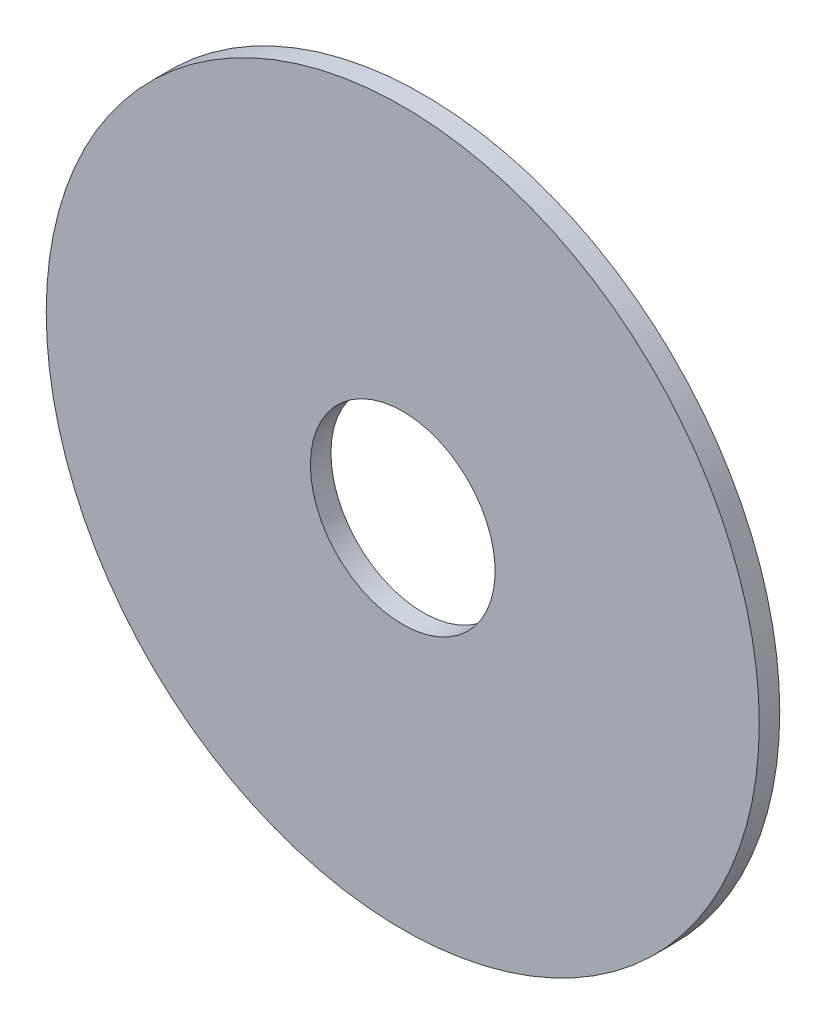
ISO-10303-21;
HEADER;
FILE_DESCRIPTION(('STEP AP214'),'2;1');
FILE_NAME('part.step','',(''),(''),'','','');
FILE_SCHEMA(('AUTOMOTIVE_DESIGN { 1 0 10303 214 1 1 1 1 }'));
ENDSEC;
DATA;
#1=APPLICATION_CONTEXT('core data for automotive mechanical design processes');
#2=APPLICATION_PROTOCOL_DEFINITION('international standard','automotive_design',2000,#1);
#3=PRODUCT_CONTEXT('',#1,'mechanical');
#4=PRODUCT('Part','Part','',(#3));
#5=PRODUCT_RELATED_PRODUCT_CATEGORY('part','',(#4));
#6=PRODUCT_DEFINITION_FORMATION('','',#4);
#7=PRODUCT_DEFINITION_CONTEXT('part definition',#1,'design');
#8=PRODUCT_DEFINITION('design','',#6,#7);
#9=PRODUCT_DEFINITION_SHAPE('','',#8);
#10=(LENGTH_UNIT() NAMED_UNIT(*) SI_UNIT(.MILLI.,.METRE.));
#11=(NAMED_UNIT(*) PLANE_ANGLE_UNIT() SI_UNIT($,.RADIAN.));
#12=(NAMED_UNIT(*) SI_UNIT($,.STERADIAN.) SOLID_ANGLE_UNIT());
#13=UNCERTAINTY_MEASURE_WITH_UNIT(LENGTH_MEASURE(1.E-05),#10,'distance_accuracy_value','');
#14=(GEOMETRIC_REPRESENTATION_CONTEXT(3) GLOBAL_UNCERTAINTY_ASSIGNED_CONTEXT((#13)) GLOBAL_UNIT_ASSIGNED_CONTEXT((#10,
#11,#12)) REPRESENTATION_CONTEXT('',''));
#15=CARTESIAN_POINT('',(0.,0.,0.));
#16=DIRECTION('',(0.,0.,1.));
#17=DIRECTION('',(1.,0.,0.));
#18=AXIS2_PLACEMENT_3D('',#15,#16,#17);
#19=CARTESIAN_POINT('',(0.,0.,2.54));
#20=DIRECTION('',(0.,0.,-1.));
#21=DIRECTION('',(-1.,0.,0.));
#22=AXIS2_PLACEMENT_3D('',#19,#20,#21);
#23=CYLINDRICAL_SURFACE('',#22,44.1325);
#24=CARTESIAN_POINT('',(0.,0.,2.54));
#25=DIRECTION('',(0.,0.,1.));
#26=DIRECTION('',(1.,0.,0.));
#27=AXIS2_PLACEMENT_3D('',#24,#25,#26);
#28=CIRCLE('',#27,44.1325);
#29=CARTESIAN_POINT('',(44.1325,0.,2.54));
#30=VERTEX_POINT('',#29);
#31=EDGE_CURVE('E10',#30,#30,#28,.T.);
#32=ORIENTED_EDGE('',*,*,#31,.F.);
#33=EDGE_LOOP('',(#32));
#34=FACE_BOUND('',#33,.T.);
#35=CARTESIAN_POINT('',(0.,0.,0.));
#36=DIRECTION('',(0.,0.,1.));
#37=DIRECTION('',(1.,0.,0.));
#38=AXIS2_PLACEMENT_3D('',#35,#36,#37);
#39=CIRCLE('',#38,44.1325);
#40=CARTESIAN_POINT('',(44.1325,0.,0.));
#41=VERTEX_POINT('',#40);
#42=EDGE_CURVE('E34',#41,#41,#39,.T.);
#43=ORIENTED_EDGE('',*,*,#42,.T.);
#44=EDGE_LOOP('',(#43));
#45=FACE_BOUND('',#44,.T.);
#46=ADVANCED_FACE('F31',(#34,#45),#23,.T.);
#47=CARTESIAN_POINT('',(0.,0.,2.54));
#48=DIRECTION('',(0.,0.,1.));
#49=DIRECTION('',(1.,0.,0.));
#50=AXIS2_PLACEMENT_3D('',#47,#48,#49);
#51=PLANE('',#50);
#52=CARTESIAN_POINT('',(0.,0.,2.54));
#53=DIRECTION('',(0.,0.,-1.));
#54=DIRECTION('',(-1.,0.,0.));
#55=AXIS2_PLACEMENT_3D('',#52,#53,#54);
#56=CIRCLE('',#55,11.43);
#57=CARTESIAN_POINT('',(-11.43,0.,2.54));
#58=VERTEX_POINT('',#57);
#59=EDGE_CURVE('E41',#58,#58,#56,.T.);
#60=ORIENTED_EDGE('',*,*,#59,.T.);
#61=EDGE_LOOP('',(#60));
#62=FACE_BOUND('',#61,.T.);
#63=ORIENTED_EDGE('',*,*,#31,.T.);
#64=EDGE_LOOP('',(#63));
#65=FACE_BOUND('',#64,.T.);
#66=ADVANCED_FACE('F49',(#62,#65),#51,.T.);
#67=CARTESIAN_POINT('',(0.,0.,0.));
#68=DIRECTION('',(0.,0.,1.));
#69=DIRECTION('',(1.,0.,0.));
#70=AXIS2_PLACEMENT_3D('',#67,#68,#69);
#71=PLANE('',#70);
#72=CARTESIAN_POINT('',(0.,0.,0.));
#73=DIRECTION('',(0.,0.,-1.));
#74=DIRECTION('',(-1.,0.,0.));
#75=AXIS2_PLACEMENT_3D('',#72,#73,#74);
#76=CIRCLE('',#75,11.43);
#77=CARTESIAN_POINT('',(-11.43,0.,0.));
#78=VERTEX_POINT('',#77);
#79=EDGE_CURVE('E43',#78,#78,#76,.T.);
#80=ORIENTED_EDGE('',*,*,#79,.F.);
#81=EDGE_LOOP('',(#80));
#82=FACE_BOUND('',#81,.T.);
#83=ORIENTED_EDGE('',*,*,#42,.F.);
#84=EDGE_LOOP('',(#83));
#85=FACE_BOUND('',#84,.T.);
#86=ADVANCED_FACE('F54',(#82,#85),#71,.F.);
#87=CARTESIAN_POINT('',(0.,0.,2.54));
#88=DIRECTION('',(0.,0.,-1.));
#89=DIRECTION('',(-1.,0.,0.));
#90=AXIS2_PLACEMENT_3D('',#87,#88,#89);
#91=CYLINDRICAL_SURFACE('',#90,11.43);
#92=ORIENTED_EDGE('',*,*,#59,.F.);
#93=EDGE_LOOP('',(#92));
#94=FACE_BOUND('',#93,.T.);
#95=ORIENTED_EDGE('',*,*,#79,.T.);
#96=EDGE_LOOP('',(#95));
#97=FACE_BOUND('',#96,.T.);
#98=ADVANCED_FACE('F51',(#94,#97),#91,.F.);
#99=CLOSED_SHELL('',(#46,#66,#86,#98));
#100=MANIFOLD_SOLID_BREP('B2',#99);
#101=ADVANCED_BREP_SHAPE_REPRESENTATION('',(#18,#100),#14);
#102=SHAPE_DEFINITION_REPRESENTATION(#9,#101);
ENDSEC;
END-ISO-10303-21;
